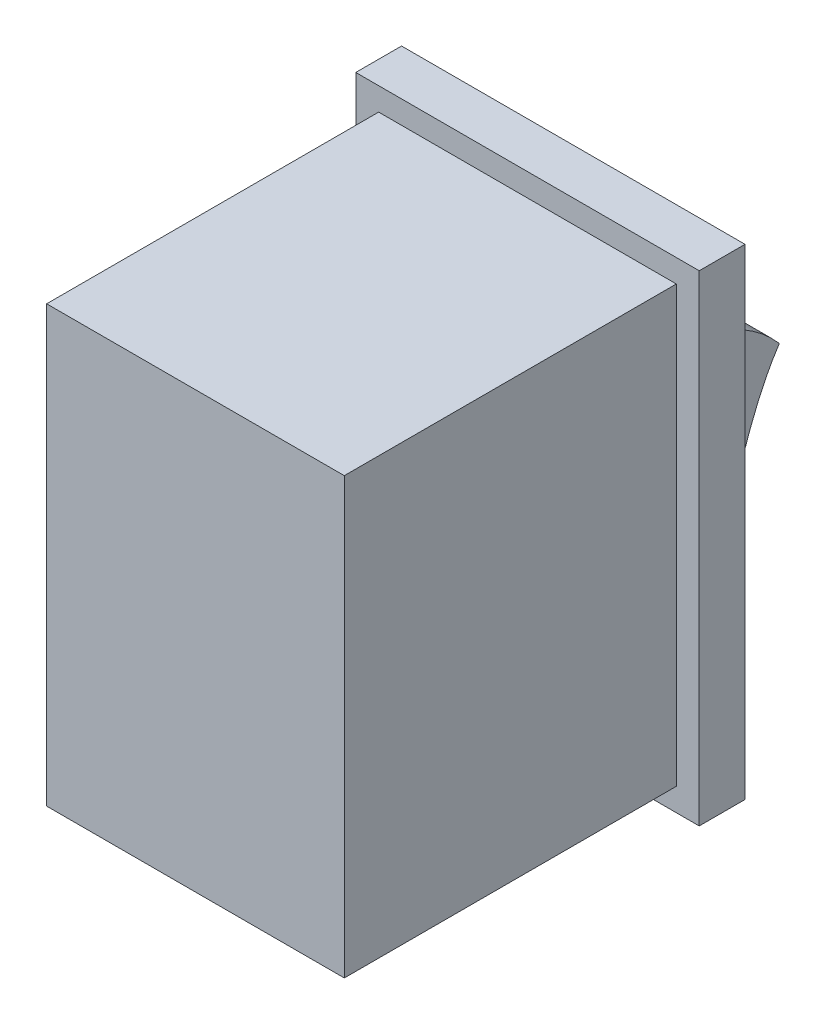
ISO-10303-21;
HEADER;
FILE_DESCRIPTION(('STEP AP214'),'2;1');
FILE_NAME('part.step','',(''),(''),'','','');
FILE_SCHEMA(('AUTOMOTIVE_DESIGN { 1 0 10303 214 1 1 1 1 }'));
ENDSEC;
DATA;
#1=APPLICATION_CONTEXT('core data for automotive mechanical design processes');
#2=APPLICATION_PROTOCOL_DEFINITION('international standard','automotive_design',2000,#1);
#3=PRODUCT_CONTEXT('',#1,'mechanical');
#4=PRODUCT('Part','Part','',(#3));
#5=PRODUCT_RELATED_PRODUCT_CATEGORY('part','',(#4));
#6=PRODUCT_DEFINITION_FORMATION('','',#4);
#7=PRODUCT_DEFINITION_CONTEXT('part definition',#1,'design');
#8=PRODUCT_DEFINITION('design','',#6,#7);
#9=PRODUCT_DEFINITION_SHAPE('','',#8);
#10=(LENGTH_UNIT() NAMED_UNIT(*) SI_UNIT(.MILLI.,.METRE.));
#11=(NAMED_UNIT(*) PLANE_ANGLE_UNIT() SI_UNIT($,.RADIAN.));
#12=(NAMED_UNIT(*) SI_UNIT($,.STERADIAN.) SOLID_ANGLE_UNIT());
#13=UNCERTAINTY_MEASURE_WITH_UNIT(LENGTH_MEASURE(1.E-05),#10,'distance_accuracy_value','');
#14=(GEOMETRIC_REPRESENTATION_CONTEXT(3) GLOBAL_UNCERTAINTY_ASSIGNED_CONTEXT((#13)) GLOBAL_UNIT_ASSIGNED_CONTEXT((#10,
#11,#12)) REPRESENTATION_CONTEXT('',''));
#15=CARTESIAN_POINT('',(0.,0.,0.));
#16=DIRECTION('',(0.,0.,1.));
#17=DIRECTION('',(1.,0.,0.));
#18=AXIS2_PLACEMENT_3D('',#15,#16,#17);
#19=CARTESIAN_POINT('',(0.,0.,-2.));
#20=DIRECTION('',(0.,0.,-1.));
#21=DIRECTION('',(-1.,0.,0.));
#22=AXIS2_PLACEMENT_3D('',#19,#20,#21);
#23=PLANE('',#22);
#24=DIRECTION('',(0.,1.,0.));
#25=VECTOR('',#24,1.);
#26=CARTESIAN_POINT('',(7.5,-10.5,-2.));
#27=LINE('',#26,#25);
#28=CARTESIAN_POINT('',(7.5,-10.5,-2.));
#29=VERTEX_POINT('',#28);
#30=CARTESIAN_POINT('',(7.5,10.5,-2.));
#31=VERTEX_POINT('',#30);
#32=EDGE_CURVE('E249',#29,#31,#27,.T.);
#33=ORIENTED_EDGE('',*,*,#32,.F.);
#34=DIRECTION('',(1.,0.,0.));
#35=VECTOR('',#34,1.);
#36=CARTESIAN_POINT('',(-7.5,-10.5,-2.));
#37=LINE('',#36,#35);
#38=CARTESIAN_POINT('',(-7.5,-10.5,-2.));
#39=VERTEX_POINT('',#38);
#40=EDGE_CURVE('E241',#39,#29,#37,.T.);
#41=ORIENTED_EDGE('',*,*,#40,.F.);
#42=DIRECTION('',(0.,-1.,0.));
#43=VECTOR('',#42,1.);
#44=CARTESIAN_POINT('',(-7.5,-10.5,-2.));
#45=LINE('',#44,#43);
#46=CARTESIAN_POINT('',(-7.5,10.5,-2.));
#47=VERTEX_POINT('',#46);
#48=EDGE_CURVE('E262',#47,#39,#45,.T.);
#49=ORIENTED_EDGE('',*,*,#48,.F.);
#50=DIRECTION('',(-1.,0.,0.));
#51=VECTOR('',#50,1.);
#52=CARTESIAN_POINT('',(-7.5,10.5,-2.));
#53=LINE('',#52,#51);
#54=EDGE_CURVE('E265',#31,#47,#53,.T.);
#55=ORIENTED_EDGE('',*,*,#54,.F.);
#56=EDGE_LOOP('',(#33,#41,#49,#55));
#57=FACE_BOUND('',#56,.T.);
#58=DIRECTION('',(1.,0.,0.));
#59=VECTOR('',#58,1.);
#60=CARTESIAN_POINT('',(-5.5,6.,-2.));
#61=LINE('',#60,#59);
#62=CARTESIAN_POINT('',(-5.5,6.,-2.));
#63=VERTEX_POINT('',#62);
#64=CARTESIAN_POINT('',(5.5,6.,-2.));
#65=VERTEX_POINT('',#64);
#66=EDGE_CURVE('E52',#63,#65,#61,.T.);
#67=ORIENTED_EDGE('',*,*,#66,.F.);
#68=DIRECTION('',(0.,-1.,0.));
#69=VECTOR('',#68,1.);
#70=CARTESIAN_POINT('',(-5.5,-7.5,-2.));
#71=LINE('',#70,#69);
#72=CARTESIAN_POINT('',(-5.5,-7.5,-2.));
#73=VERTEX_POINT('',#72);
#74=EDGE_CURVE('E47',#63,#73,#71,.T.);
#75=ORIENTED_EDGE('',*,*,#74,.T.);
#76=DIRECTION('',(1.,0.,0.));
#77=VECTOR('',#76,1.);
#78=CARTESIAN_POINT('',(-5.5,-7.5,-2.));
#79=LINE('',#78,#77);
#80=CARTESIAN_POINT('',(5.5,-7.5,-2.));
#81=VERTEX_POINT('',#80);
#82=EDGE_CURVE('E259',#73,#81,#79,.T.);
#83=ORIENTED_EDGE('',*,*,#82,.T.);
#84=DIRECTION('',(0.,-1.,0.));
#85=VECTOR('',#84,1.);
#86=CARTESIAN_POINT('',(5.5,-7.5,-2.));
#87=LINE('',#86,#85);
#88=EDGE_CURVE('E129',#65,#81,#87,.T.);
#89=ORIENTED_EDGE('',*,*,#88,.F.);
#90=EDGE_LOOP('',(#67,#75,#83,#89));
#91=FACE_BOUND('',#90,.T.);
#92=ADVANCED_FACE('F32',(#57,#91),#23,.T.);
#93=CARTESIAN_POINT('',(6.5,-9.5,14.5));
#94=DIRECTION('',(-1.,0.,0.));
#95=DIRECTION('',(0.,0.,1.));
#96=AXIS2_PLACEMENT_3D('',#93,#94,#95);
#97=PLANE('',#96);
#98=DIRECTION('',(0.,1.,0.));
#99=VECTOR('',#98,1.);
#100=CARTESIAN_POINT('',(6.5,-9.5,0.));
#101=LINE('',#100,#99);
#102=CARTESIAN_POINT('',(6.5,-9.5,0.));
#103=VERTEX_POINT('',#102);
#104=CARTESIAN_POINT('',(6.5,9.5,0.));
#105=VERTEX_POINT('',#104);
#106=EDGE_CURVE('E212',#103,#105,#101,.T.);
#107=ORIENTED_EDGE('',*,*,#106,.T.);
#108=DIRECTION('',(0.,0.,-1.));
#109=VECTOR('',#108,1.);
#110=CARTESIAN_POINT('',(6.5,9.5,14.5));
#111=LINE('',#110,#109);
#112=CARTESIAN_POINT('',(6.5,9.5,14.5));
#113=VERTEX_POINT('',#112);
#114=EDGE_CURVE('E11',#113,#105,#111,.T.);
#115=ORIENTED_EDGE('',*,*,#114,.F.);
#116=DIRECTION('',(0.,1.,0.));
#117=VECTOR('',#116,1.);
#118=CARTESIAN_POINT('',(6.5,-9.5,14.5));
#119=LINE('',#118,#117);
#120=CARTESIAN_POINT('',(6.5,-9.5,14.5));
#121=VERTEX_POINT('',#120);
#122=EDGE_CURVE('E228',#121,#113,#119,.T.);
#123=ORIENTED_EDGE('',*,*,#122,.F.);
#124=DIRECTION('',(0.,0.,-1.));
#125=VECTOR('',#124,1.);
#126=CARTESIAN_POINT('',(6.5,-9.5,14.5));
#127=LINE('',#126,#125);
#128=EDGE_CURVE('E219',#121,#103,#127,.T.);
#129=ORIENTED_EDGE('',*,*,#128,.T.);
#130=EDGE_LOOP('',(#107,#115,#123,#129));
#131=FACE_BOUND('',#130,.T.);
#132=ADVANCED_FACE('F34',(#131),#97,.F.);
#133=CARTESIAN_POINT('',(-6.5,9.5,14.5));
#134=DIRECTION('',(0.,-1.,0.));
#135=DIRECTION('',(0.,0.,-1.));
#136=AXIS2_PLACEMENT_3D('',#133,#134,#135);
#137=PLANE('',#136);
#138=DIRECTION('',(-1.,0.,0.));
#139=VECTOR('',#138,1.);
#140=CARTESIAN_POINT('',(-6.5,9.5,0.));
#141=LINE('',#140,#139);
#142=CARTESIAN_POINT('',(-6.5,9.5,0.));
#143=VERTEX_POINT('',#142);
#144=EDGE_CURVE('E205',#105,#143,#141,.T.);
#145=ORIENTED_EDGE('',*,*,#144,.T.);
#146=DIRECTION('',(0.,0.,-1.));
#147=VECTOR('',#146,1.);
#148=CARTESIAN_POINT('',(-6.5,9.5,14.5));
#149=LINE('',#148,#147);
#150=CARTESIAN_POINT('',(-6.5,9.5,14.5));
#151=VERTEX_POINT('',#150);
#152=EDGE_CURVE('E40',#151,#143,#149,.T.);
#153=ORIENTED_EDGE('',*,*,#152,.F.);
#154=DIRECTION('',(-1.,0.,0.));
#155=VECTOR('',#154,1.);
#156=CARTESIAN_POINT('',(-6.5,9.5,14.5));
#157=LINE('',#156,#155);
#158=EDGE_CURVE('E234',#113,#151,#157,.T.);
#159=ORIENTED_EDGE('',*,*,#158,.F.);
#160=ORIENTED_EDGE('',*,*,#114,.T.);
#161=EDGE_LOOP('',(#145,#153,#159,#160));
#162=FACE_BOUND('',#161,.T.);
#163=ADVANCED_FACE('F195',(#162),#137,.F.);
#164=CARTESIAN_POINT('',(-6.5,-9.5,14.5));
#165=DIRECTION('',(1.,0.,0.));
#166=DIRECTION('',(0.,0.,-1.));
#167=AXIS2_PLACEMENT_3D('',#164,#165,#166);
#168=PLANE('',#167);
#169=DIRECTION('',(0.,-1.,0.));
#170=VECTOR('',#169,1.);
#171=CARTESIAN_POINT('',(-6.5,-9.5,0.));
#172=LINE('',#171,#170);
#173=CARTESIAN_POINT('',(-6.5,-9.5,0.));
#174=VERTEX_POINT('',#173);
#175=EDGE_CURVE('E211',#143,#174,#172,.T.);
#176=ORIENTED_EDGE('',*,*,#175,.T.);
#177=DIRECTION('',(0.,0.,-1.));
#178=VECTOR('',#177,1.);
#179=CARTESIAN_POINT('',(-6.5,-9.5,14.5));
#180=LINE('',#179,#178);
#181=CARTESIAN_POINT('',(-6.5,-9.5,14.5));
#182=VERTEX_POINT('',#181);
#183=EDGE_CURVE('E218',#182,#174,#180,.T.);
#184=ORIENTED_EDGE('',*,*,#183,.F.);
#185=DIRECTION('',(0.,-1.,0.));
#186=VECTOR('',#185,1.);
#187=CARTESIAN_POINT('',(-6.5,-9.5,14.5));
#188=LINE('',#187,#186);
#189=EDGE_CURVE('E217',#151,#182,#188,.T.);
#190=ORIENTED_EDGE('',*,*,#189,.F.);
#191=ORIENTED_EDGE('',*,*,#152,.T.);
#192=EDGE_LOOP('',(#176,#184,#190,#191));
#193=FACE_BOUND('',#192,.T.);
#194=ADVANCED_FACE('F192',(#193),#168,.F.);
#195=CARTESIAN_POINT('',(-6.5,-9.5,14.5));
#196=DIRECTION('',(0.,1.,0.));
#197=DIRECTION('',(0.,0.,1.));
#198=AXIS2_PLACEMENT_3D('',#195,#196,#197);
#199=PLANE('',#198);
#200=DIRECTION('',(1.,0.,0.));
#201=VECTOR('',#200,1.);
#202=CARTESIAN_POINT('',(-6.5,-9.5,0.));
#203=LINE('',#202,#201);
#204=EDGE_CURVE('E225',#174,#103,#203,.T.);
#205=ORIENTED_EDGE('',*,*,#204,.T.);
#206=ORIENTED_EDGE('',*,*,#128,.F.);
#207=DIRECTION('',(1.,0.,0.));
#208=VECTOR('',#207,1.);
#209=CARTESIAN_POINT('',(-6.5,-9.5,14.5));
#210=LINE('',#209,#208);
#211=EDGE_CURVE('E224',#182,#121,#210,.T.);
#212=ORIENTED_EDGE('',*,*,#211,.F.);
#213=ORIENTED_EDGE('',*,*,#183,.T.);
#214=EDGE_LOOP('',(#205,#206,#212,#213));
#215=FACE_BOUND('',#214,.T.);
#216=ADVANCED_FACE('F188',(#215),#199,.F.);
#217=CARTESIAN_POINT('',(0.,0.,14.5));
#218=DIRECTION('',(0.,0.,-1.));
#219=DIRECTION('',(-1.,0.,0.));
#220=AXIS2_PLACEMENT_3D('',#217,#218,#219);
#221=PLANE('',#220);
#222=ORIENTED_EDGE('',*,*,#122,.T.);
#223=ORIENTED_EDGE('',*,*,#158,.T.);
#224=ORIENTED_EDGE('',*,*,#189,.T.);
#225=ORIENTED_EDGE('',*,*,#211,.T.);
#226=EDGE_LOOP('',(#222,#223,#224,#225));
#227=FACE_BOUND('',#226,.T.);
#228=ADVANCED_FACE('F170',(#227),#221,.F.);
#229=CARTESIAN_POINT('',(0.,0.,0.));
#230=DIRECTION('',(0.,0.,-1.));
#231=DIRECTION('',(-1.,0.,0.));
#232=AXIS2_PLACEMENT_3D('',#229,#230,#231);
#233=PLANE('',#232);
#234=DIRECTION('',(0.,1.,0.));
#235=VECTOR('',#234,1.);
#236=CARTESIAN_POINT('',(7.5,-10.5,0.));
#237=LINE('',#236,#235);
#238=CARTESIAN_POINT('',(7.5,-10.5,0.));
#239=VERTEX_POINT('',#238);
#240=CARTESIAN_POINT('',(7.5,10.5,0.));
#241=VERTEX_POINT('',#240);
#242=EDGE_CURVE('E256',#239,#241,#237,.T.);
#243=ORIENTED_EDGE('',*,*,#242,.T.);
#244=DIRECTION('',(-1.,0.,0.));
#245=VECTOR('',#244,1.);
#246=CARTESIAN_POINT('',(-7.5,10.5,0.));
#247=LINE('',#246,#245);
#248=CARTESIAN_POINT('',(-7.5,10.5,0.));
#249=VERTEX_POINT('',#248);
#250=EDGE_CURVE('E253',#241,#249,#247,.T.);
#251=ORIENTED_EDGE('',*,*,#250,.T.);
#252=DIRECTION('',(0.,-1.,0.));
#253=VECTOR('',#252,1.);
#254=CARTESIAN_POINT('',(-7.5,-10.5,0.));
#255=LINE('',#254,#253);
#256=CARTESIAN_POINT('',(-7.5,-10.5,0.));
#257=VERTEX_POINT('',#256);
#258=EDGE_CURVE('E250',#249,#257,#255,.T.);
#259=ORIENTED_EDGE('',*,*,#258,.T.);
#260=DIRECTION('',(1.,0.,0.));
#261=VECTOR('',#260,1.);
#262=CARTESIAN_POINT('',(-7.5,-10.5,0.));
#263=LINE('',#262,#261);
#264=EDGE_CURVE('E246',#257,#239,#263,.T.);
#265=ORIENTED_EDGE('',*,*,#264,.T.);
#266=EDGE_LOOP('',(#243,#251,#259,#265));
#267=FACE_BOUND('',#266,.T.);
#268=ORIENTED_EDGE('',*,*,#144,.F.);
#269=ORIENTED_EDGE('',*,*,#106,.F.);
#270=ORIENTED_EDGE('',*,*,#204,.F.);
#271=ORIENTED_EDGE('',*,*,#175,.F.);
#272=EDGE_LOOP('',(#268,#269,#270,#271));
#273=FACE_BOUND('',#272,.T.);
#274=ADVANCED_FACE('F166',(#267,#273),#233,.F.);
#275=CARTESIAN_POINT('',(7.5,-10.5,-2.));
#276=DIRECTION('',(1.,0.,0.));
#277=DIRECTION('',(0.,0.,-1.));
#278=AXIS2_PLACEMENT_3D('',#275,#276,#277);
#279=PLANE('',#278);
#280=ORIENTED_EDGE('',*,*,#242,.F.);
#281=DIRECTION('',(0.,0.,1.));
#282=VECTOR('',#281,1.);
#283=CARTESIAN_POINT('',(7.5,-10.5,-2.));
#284=LINE('',#283,#282);
#285=EDGE_CURVE('E231',#29,#239,#284,.T.);
#286=ORIENTED_EDGE('',*,*,#285,.F.);
#287=ORIENTED_EDGE('',*,*,#32,.T.);
#288=DIRECTION('',(0.,0.,1.));
#289=VECTOR('',#288,1.);
#290=CARTESIAN_POINT('',(7.5,10.5,-2.));
#291=LINE('',#290,#289);
#292=EDGE_CURVE('E238',#31,#241,#291,.T.);
#293=ORIENTED_EDGE('',*,*,#292,.T.);
#294=EDGE_LOOP('',(#280,#286,#287,#293));
#295=FACE_BOUND('',#294,.T.);
#296=ADVANCED_FACE('F169',(#295),#279,.T.);
#297=CARTESIAN_POINT('',(-7.5,-10.5,-2.));
#298=DIRECTION('',(0.,-1.,0.));
#299=DIRECTION('',(0.,0.,-1.));
#300=AXIS2_PLACEMENT_3D('',#297,#298,#299);
#301=PLANE('',#300);
#302=ORIENTED_EDGE('',*,*,#264,.F.);
#303=DIRECTION('',(0.,0.,1.));
#304=VECTOR('',#303,1.);
#305=CARTESIAN_POINT('',(-7.5,-10.5,-2.));
#306=LINE('',#305,#304);
#307=EDGE_CURVE('E243',#39,#257,#306,.T.);
#308=ORIENTED_EDGE('',*,*,#307,.F.);
#309=ORIENTED_EDGE('',*,*,#40,.T.);
#310=ORIENTED_EDGE('',*,*,#285,.T.);
#311=EDGE_LOOP('',(#302,#308,#309,#310));
#312=FACE_BOUND('',#311,.T.);
#313=ADVANCED_FACE('F172',(#312),#301,.T.);
#314=CARTESIAN_POINT('',(-7.5,-10.5,-2.));
#315=DIRECTION('',(-1.,0.,0.));
#316=DIRECTION('',(0.,0.,1.));
#317=AXIS2_PLACEMENT_3D('',#314,#315,#316);
#318=PLANE('',#317);
#319=ORIENTED_EDGE('',*,*,#258,.F.);
#320=DIRECTION('',(0.,0.,1.));
#321=VECTOR('',#320,1.);
#322=CARTESIAN_POINT('',(-7.5,10.5,-2.));
#323=LINE('',#322,#321);
#324=EDGE_CURVE('E240',#47,#249,#323,.T.);
#325=ORIENTED_EDGE('',*,*,#324,.F.);
#326=ORIENTED_EDGE('',*,*,#48,.T.);
#327=ORIENTED_EDGE('',*,*,#307,.T.);
#328=EDGE_LOOP('',(#319,#325,#326,#327));
#329=FACE_BOUND('',#328,.T.);
#330=ADVANCED_FACE('F175',(#329),#318,.T.);
#331=CARTESIAN_POINT('',(-7.5,10.5,-2.));
#332=DIRECTION('',(0.,1.,0.));
#333=DIRECTION('',(0.,0.,1.));
#334=AXIS2_PLACEMENT_3D('',#331,#332,#333);
#335=PLANE('',#334);
#336=ORIENTED_EDGE('',*,*,#250,.F.);
#337=ORIENTED_EDGE('',*,*,#292,.F.);
#338=ORIENTED_EDGE('',*,*,#54,.T.);
#339=ORIENTED_EDGE('',*,*,#324,.T.);
#340=EDGE_LOOP('',(#336,#337,#338,#339));
#341=FACE_BOUND('',#340,.T.);
#342=ADVANCED_FACE('F161',(#341),#335,.T.);
#343=CARTESIAN_POINT('',(-5.5,-7.5,-2.));
#344=CARTESIAN_POINT('',(-5.5,1.12780803141261,-3.53668550287901));
#345=CARTESIAN_POINT('',(-5.5,4.,-5.5));
#346=B_SPLINE_CURVE_WITH_KNOTS('',2,(#343,#344,#345),.UNSPECIFIED.,.F.,.F.,(3,3),(0.,1.),.UNSPECIFIED.);
#347=DIRECTION('',(1.,0.,0.));
#348=VECTOR('',#347,1.);
#349=SURFACE_OF_LINEAR_EXTRUSION('',#346,#348);
#350=DIRECTION('',(1.,0.,0.));
#351=VECTOR('',#350,1.);
#352=CARTESIAN_POINT('',(-5.5,4.,-5.5));
#353=LINE('',#352,#351);
#354=CARTESIAN_POINT('',(-5.5,4.,-5.5));
#355=VERTEX_POINT('',#354);
#356=CARTESIAN_POINT('',(5.5,4.,-5.5));
#357=VERTEX_POINT('',#356);
#358=EDGE_CURVE('E114',#355,#357,#353,.T.);
#359=ORIENTED_EDGE('',*,*,#358,.T.);
#360=CARTESIAN_POINT('',(5.5,-7.5,-2.));
#361=CARTESIAN_POINT('',(5.5,1.12780803141261,-3.53668550287901));
#362=CARTESIAN_POINT('',(5.5,4.,-5.5));
#363=B_SPLINE_CURVE_WITH_KNOTS('',2,(#360,#361,#362),.UNSPECIFIED.,.F.,.F.,(3,3),(0.,1.),.UNSPECIFIED.);
#364=EDGE_CURVE('E118',#81,#357,#363,.T.);
#365=ORIENTED_EDGE('',*,*,#364,.F.);
#366=ORIENTED_EDGE('',*,*,#82,.F.);
#367=EDGE_CURVE('E120',#73,#355,#346,.T.);
#368=ORIENTED_EDGE('',*,*,#367,.T.);
#369=EDGE_LOOP('',(#359,#365,#366,#368));
#370=FACE_BOUND('',#369,.T.);
#371=ADVANCED_FACE('F116',(#370),#349,.T.);
#372=CARTESIAN_POINT('',(-5.5,4.,-5.5));
#373=CARTESIAN_POINT('',(-5.5,5.59816268096128,-4.11467248259465));
#374=CARTESIAN_POINT('',(-5.5,6.,-2.));
#375=B_SPLINE_CURVE_WITH_KNOTS('',2,(#372,#373,#374),.UNSPECIFIED.,.F.,.F.,(3,3),(0.,1.),.UNSPECIFIED.);
#376=DIRECTION('',(1.,0.,0.));
#377=VECTOR('',#376,1.);
#378=SURFACE_OF_LINEAR_EXTRUSION('',#375,#377);
#379=ORIENTED_EDGE('',*,*,#66,.T.);
#380=CARTESIAN_POINT('',(5.5,4.,-5.5));
#381=CARTESIAN_POINT('',(5.5,5.59816268096128,-4.11467248259465));
#382=CARTESIAN_POINT('',(5.5,6.,-2.));
#383=B_SPLINE_CURVE_WITH_KNOTS('',2,(#380,#381,#382),.UNSPECIFIED.,.F.,.F.,(3,3),(0.,1.),.UNSPECIFIED.);
#384=EDGE_CURVE('E125',#357,#65,#383,.T.);
#385=ORIENTED_EDGE('',*,*,#384,.F.);
#386=ORIENTED_EDGE('',*,*,#358,.F.);
#387=EDGE_CURVE('E149',#355,#63,#375,.T.);
#388=ORIENTED_EDGE('',*,*,#387,.T.);
#389=EDGE_LOOP('',(#379,#385,#386,#388));
#390=FACE_BOUND('',#389,.T.);
#391=ADVANCED_FACE('F126',(#390),#378,.T.);
#392=CARTESIAN_POINT('',(-5.5,-0.311095984293695,-3.64334275143951));
#393=DIRECTION('',(1.,0.,0.));
#394=DIRECTION('',(0.,0.,-1.));
#395=AXIS2_PLACEMENT_3D('',#392,#393,#394);
#396=PLANE('',#395);
#397=ORIENTED_EDGE('',*,*,#367,.F.);
#398=ORIENTED_EDGE('',*,*,#74,.F.);
#399=ORIENTED_EDGE('',*,*,#387,.F.);
#400=EDGE_LOOP('',(#397,#398,#399));
#401=FACE_BOUND('',#400,.T.);
#402=ADVANCED_FACE('F272',(#401),#396,.F.);
#403=CARTESIAN_POINT('',(5.5,-0.311095984293695,-3.64334275143951));
#404=DIRECTION('',(1.,0.,0.));
#405=DIRECTION('',(0.,0.,-1.));
#406=AXIS2_PLACEMENT_3D('',#403,#404,#405);
#407=PLANE('',#406);
#408=ORIENTED_EDGE('',*,*,#364,.T.);
#409=ORIENTED_EDGE('',*,*,#384,.T.);
#410=ORIENTED_EDGE('',*,*,#88,.T.);
#411=EDGE_LOOP('',(#408,#409,#410));
#412=FACE_BOUND('',#411,.T.);
#413=ADVANCED_FACE('F131',(#412),#407,.T.);
#414=CLOSED_SHELL('',(#92,#132,#163,#194,#216,#228,#274,#296,#313,#330,#342,#371,#391,#402,#413));
#415=MANIFOLD_SOLID_BREP('B2',#414);
#416=ADVANCED_BREP_SHAPE_REPRESENTATION('',(#18,#415),#14);
#417=SHAPE_DEFINITION_REPRESENTATION(#9,#416);
ENDSEC;
END-ISO-10303-21;
